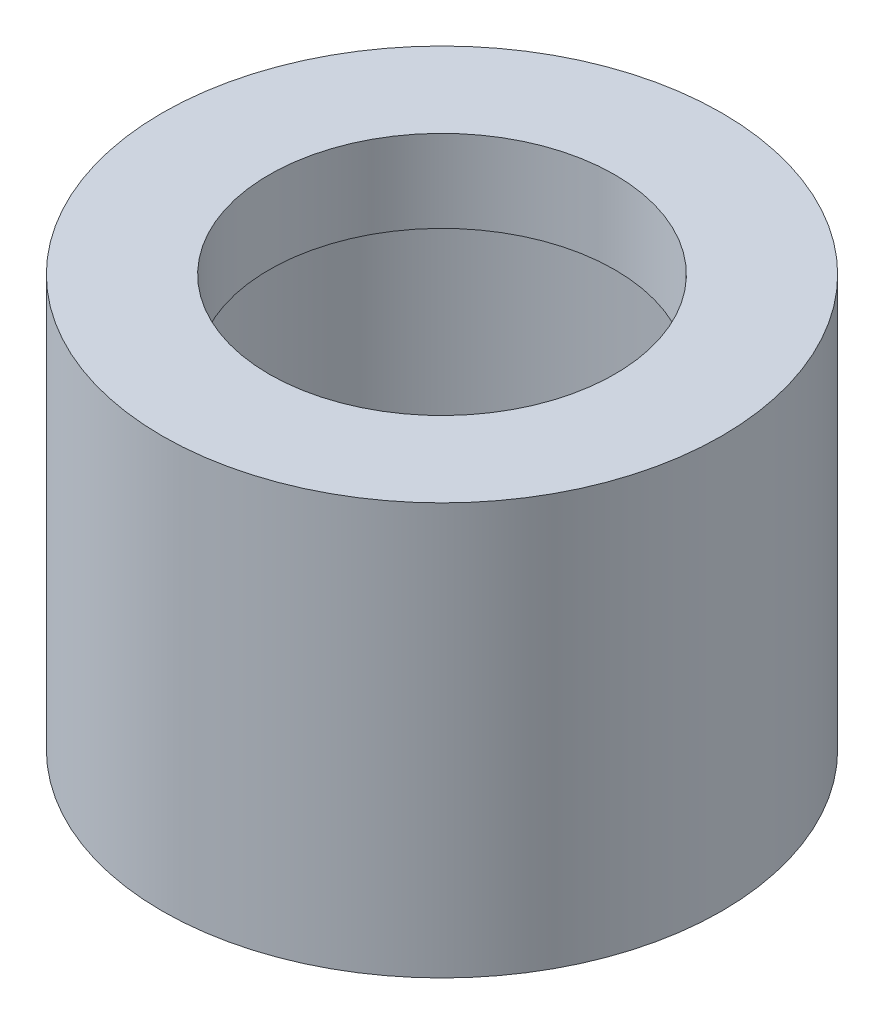
ISO-10303-21;
HEADER;
FILE_DESCRIPTION(('STEP AP214'),'2;1');
FILE_NAME('part.step','',(''),(''),'','','');
FILE_SCHEMA(('AUTOMOTIVE_DESIGN { 1 0 10303 214 1 1 1 1 }'));
ENDSEC;
DATA;
#1=APPLICATION_CONTEXT('core data for automotive mechanical design processes');
#2=APPLICATION_PROTOCOL_DEFINITION('international standard','automotive_design',2000,#1);
#3=PRODUCT_CONTEXT('',#1,'mechanical');
#4=PRODUCT('Part','Part','',(#3));
#5=PRODUCT_RELATED_PRODUCT_CATEGORY('part','',(#4));
#6=PRODUCT_DEFINITION_FORMATION('','',#4);
#7=PRODUCT_DEFINITION_CONTEXT('part definition',#1,'design');
#8=PRODUCT_DEFINITION('design','',#6,#7);
#9=PRODUCT_DEFINITION_SHAPE('','',#8);
#10=(LENGTH_UNIT() NAMED_UNIT(*) SI_UNIT(.MILLI.,.METRE.));
#11=(NAMED_UNIT(*) PLANE_ANGLE_UNIT() SI_UNIT($,.RADIAN.));
#12=(NAMED_UNIT(*) SI_UNIT($,.STERADIAN.) SOLID_ANGLE_UNIT());
#13=UNCERTAINTY_MEASURE_WITH_UNIT(LENGTH_MEASURE(1.E-05),#10,'distance_accuracy_value','');
#14=(GEOMETRIC_REPRESENTATION_CONTEXT(3) GLOBAL_UNCERTAINTY_ASSIGNED_CONTEXT((#13)) GLOBAL_UNIT_ASSIGNED_CONTEXT((#10,
#11,#12)) REPRESENTATION_CONTEXT('',''));
#15=CARTESIAN_POINT('',(0.,0.,0.));
#16=DIRECTION('',(0.,0.,1.));
#17=DIRECTION('',(1.,0.,0.));
#18=AXIS2_PLACEMENT_3D('',#15,#16,#17);
#19=CARTESIAN_POINT('',(0.,0.,0.));
#20=DIRECTION('',(0.,1.,0.));
#21=DIRECTION('',(0.,0.,1.));
#22=AXIS2_PLACEMENT_3D('',#19,#20,#21);
#23=PLANE('',#22);
#24=CARTESIAN_POINT('',(0.,0.,0.));
#25=DIRECTION('',(0.,1.,0.));
#26=DIRECTION('',(0.,0.,1.));
#27=AXIS2_PLACEMENT_3D('',#24,#25,#26);
#28=CIRCLE('',#27,17.);
#29=CARTESIAN_POINT('',(0.,0.,17.));
#30=VERTEX_POINT('',#29);
#31=EDGE_CURVE('E10',#30,#30,#28,.T.);
#32=ORIENTED_EDGE('',*,*,#31,.F.);
#33=EDGE_LOOP('',(#32));
#34=FACE_BOUND('',#33,.T.);
#35=CARTESIAN_POINT('',(0.,0.,0.));
#36=DIRECTION('',(0.,1.,0.));
#37=DIRECTION('',(0.,0.,1.));
#38=AXIS2_PLACEMENT_3D('',#35,#36,#37);
#39=CIRCLE('',#38,15.);
#40=CARTESIAN_POINT('',(0.,0.,15.));
#41=VERTEX_POINT('',#40);
#42=EDGE_CURVE('E44',#41,#41,#39,.T.);
#43=ORIENTED_EDGE('',*,*,#42,.T.);
#44=EDGE_LOOP('',(#43));
#45=FACE_BOUND('',#44,.T.);
#46=ADVANCED_FACE('F37',(#34,#45),#23,.F.);
#47=CARTESIAN_POINT('',(0.,20.,0.));
#48=DIRECTION('',(0.,-1.,0.));
#49=DIRECTION('',(0.,0.,-1.));
#50=AXIS2_PLACEMENT_3D('',#47,#48,#49);
#51=CYLINDRICAL_SURFACE('',#50,17.);
#52=ORIENTED_EDGE('',*,*,#31,.T.);
#53=EDGE_LOOP('',(#52));
#54=FACE_BOUND('',#53,.T.);
#55=CARTESIAN_POINT('',(0.,25.,0.));
#56=DIRECTION('',(0.,1.,0.));
#57=DIRECTION('',(0.,0.,1.));
#58=AXIS2_PLACEMENT_3D('',#55,#56,#57);
#59=CIRCLE('',#58,17.);
#60=CARTESIAN_POINT('',(0.,25.,17.));
#61=VERTEX_POINT('',#60);
#62=EDGE_CURVE('E52',#61,#61,#59,.T.);
#63=ORIENTED_EDGE('',*,*,#62,.F.);
#64=EDGE_LOOP('',(#63));
#65=FACE_BOUND('',#64,.T.);
#66=ADVANCED_FACE('F39',(#54,#65),#51,.T.);
#67=CARTESIAN_POINT('',(0.,20.,0.));
#68=DIRECTION('',(0.,-1.,0.));
#69=DIRECTION('',(0.,0.,-1.));
#70=AXIS2_PLACEMENT_3D('',#67,#68,#69);
#71=CYLINDRICAL_SURFACE('',#70,15.);
#72=CARTESIAN_POINT('',(0.,20.,0.));
#73=DIRECTION('',(0.,1.,0.));
#74=DIRECTION('',(0.,0.,1.));
#75=AXIS2_PLACEMENT_3D('',#72,#73,#74);
#76=CIRCLE('',#75,15.);
#77=CARTESIAN_POINT('',(0.,20.,15.));
#78=VERTEX_POINT('',#77);
#79=EDGE_CURVE('E48',#78,#78,#76,.T.);
#80=ORIENTED_EDGE('',*,*,#79,.T.);
#81=EDGE_LOOP('',(#80));
#82=FACE_BOUND('',#81,.T.);
#83=ORIENTED_EDGE('',*,*,#42,.F.);
#84=EDGE_LOOP('',(#83));
#85=FACE_BOUND('',#84,.T.);
#86=ADVANCED_FACE('F74',(#82,#85),#71,.F.);
#87=CARTESIAN_POINT('',(0.,20.,0.));
#88=DIRECTION('',(0.,1.,0.));
#89=DIRECTION('',(0.,0.,1.));
#90=AXIS2_PLACEMENT_3D('',#87,#88,#89);
#91=PLANE('',#90);
#92=CARTESIAN_POINT('',(0.,20.,0.));
#93=DIRECTION('',(0.,1.,0.));
#94=DIRECTION('',(0.,0.,1.));
#95=AXIS2_PLACEMENT_3D('',#92,#93,#94);
#96=CIRCLE('',#95,10.5);
#97=CARTESIAN_POINT('',(0.,20.,10.5));
#98=VERTEX_POINT('',#97);
#99=EDGE_CURVE('E55',#98,#98,#96,.T.);
#100=ORIENTED_EDGE('',*,*,#99,.T.);
#101=EDGE_LOOP('',(#100));
#102=FACE_BOUND('',#101,.T.);
#103=ORIENTED_EDGE('',*,*,#79,.F.);
#104=EDGE_LOOP('',(#103));
#105=FACE_BOUND('',#104,.T.);
#106=ADVANCED_FACE('F79',(#102,#105),#91,.F.);
#107=CARTESIAN_POINT('',(0.,25.,0.));
#108=DIRECTION('',(0.,-1.,0.));
#109=DIRECTION('',(0.,0.,-1.));
#110=AXIS2_PLACEMENT_3D('',#107,#108,#109);
#111=CYLINDRICAL_SURFACE('',#110,10.5);
#112=CARTESIAN_POINT('',(0.,25.,0.));
#113=DIRECTION('',(0.,1.,0.));
#114=DIRECTION('',(0.,0.,1.));
#115=AXIS2_PLACEMENT_3D('',#112,#113,#114);
#116=CIRCLE('',#115,10.5);
#117=CARTESIAN_POINT('',(0.,25.,10.5));
#118=VERTEX_POINT('',#117);
#119=EDGE_CURVE('E58',#118,#118,#116,.T.);
#120=ORIENTED_EDGE('',*,*,#119,.T.);
#121=EDGE_LOOP('',(#120));
#122=FACE_BOUND('',#121,.T.);
#123=ORIENTED_EDGE('',*,*,#99,.F.);
#124=EDGE_LOOP('',(#123));
#125=FACE_BOUND('',#124,.T.);
#126=ADVANCED_FACE('F64',(#122,#125),#111,.F.);
#127=CARTESIAN_POINT('',(0.,25.,0.));
#128=DIRECTION('',(0.,1.,0.));
#129=DIRECTION('',(0.,0.,1.));
#130=AXIS2_PLACEMENT_3D('',#127,#128,#129);
#131=PLANE('',#130);
#132=ORIENTED_EDGE('',*,*,#119,.F.);
#133=EDGE_LOOP('',(#132));
#134=FACE_BOUND('',#133,.T.);
#135=ORIENTED_EDGE('',*,*,#62,.T.);
#136=EDGE_LOOP('',(#135));
#137=FACE_BOUND('',#136,.T.);
#138=ADVANCED_FACE('F67',(#134,#137),#131,.T.);
#139=CLOSED_SHELL('',(#46,#66,#86,#106,#126,#138));
#140=MANIFOLD_SOLID_BREP('B2',#139);
#141=ADVANCED_BREP_SHAPE_REPRESENTATION('',(#18,#140),#14);
#142=SHAPE_DEFINITION_REPRESENTATION(#9,#141);
ENDSEC;
END-ISO-10303-21;
